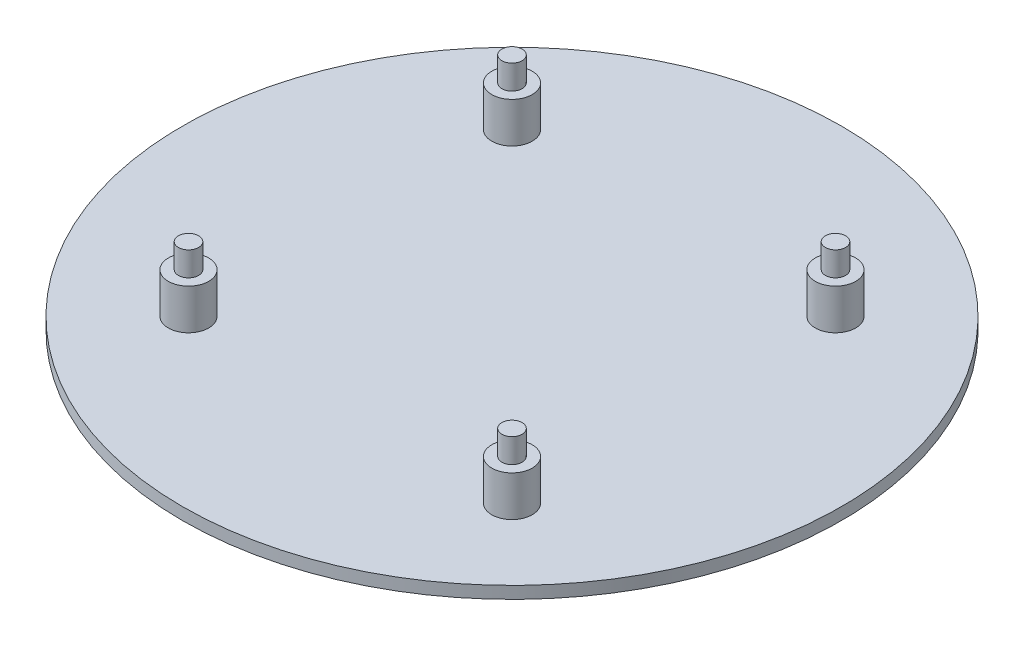
ISO-10303-21;
HEADER;
FILE_DESCRIPTION(('STEP AP214'),'2;1');
FILE_NAME('part.step','',(''),(''),'','','');
FILE_SCHEMA(('AUTOMOTIVE_DESIGN { 1 0 10303 214 1 1 1 1 }'));
ENDSEC;
DATA;
#1=APPLICATION_CONTEXT('core data for automotive mechanical design processes');
#2=APPLICATION_PROTOCOL_DEFINITION('international standard','automotive_design',2000,#1);
#3=PRODUCT_CONTEXT('',#1,'mechanical');
#4=PRODUCT('Part','Part','',(#3));
#5=PRODUCT_RELATED_PRODUCT_CATEGORY('part','',(#4));
#6=PRODUCT_DEFINITION_FORMATION('','',#4);
#7=PRODUCT_DEFINITION_CONTEXT('part definition',#1,'design');
#8=PRODUCT_DEFINITION('design','',#6,#7);
#9=PRODUCT_DEFINITION_SHAPE('','',#8);
#10=(LENGTH_UNIT() NAMED_UNIT(*) SI_UNIT(.MILLI.,.METRE.));
#11=(NAMED_UNIT(*) PLANE_ANGLE_UNIT() SI_UNIT($,.RADIAN.));
#12=(NAMED_UNIT(*) SI_UNIT($,.STERADIAN.) SOLID_ANGLE_UNIT());
#13=UNCERTAINTY_MEASURE_WITH_UNIT(LENGTH_MEASURE(1.E-05),#10,'distance_accuracy_value','');
#14=(GEOMETRIC_REPRESENTATION_CONTEXT(3) GLOBAL_UNCERTAINTY_ASSIGNED_CONTEXT((#13)) GLOBAL_UNIT_ASSIGNED_CONTEXT((#10,
#11,#12)) REPRESENTATION_CONTEXT('',''));
#15=CARTESIAN_POINT('',(0.,0.,0.));
#16=DIRECTION('',(0.,0.,1.));
#17=DIRECTION('',(1.,0.,0.));
#18=AXIS2_PLACEMENT_3D('',#15,#16,#17);
#19=CARTESIAN_POINT('',(0.,3.,0.));
#20=DIRECTION('',(0.,-1.,0.));
#21=DIRECTION('',(0.,0.,-1.));
#22=AXIS2_PLACEMENT_3D('',#19,#20,#21);
#23=CYLINDRICAL_SURFACE('',#22,81.5);
#24=CARTESIAN_POINT('',(0.,3.,0.));
#25=DIRECTION('',(0.,1.,0.));
#26=DIRECTION('',(0.,0.,1.));
#27=AXIS2_PLACEMENT_3D('',#24,#25,#26);
#28=CIRCLE('',#27,81.5);
#29=CARTESIAN_POINT('',(0.,3.,81.5));
#30=VERTEX_POINT('',#29);
#31=EDGE_CURVE('E43',#30,#30,#28,.T.);
#32=ORIENTED_EDGE('',*,*,#31,.F.);
#33=EDGE_LOOP('',(#32));
#34=FACE_BOUND('',#33,.T.);
#35=CARTESIAN_POINT('',(0.,0.,0.));
#36=DIRECTION('',(0.,1.,0.));
#37=DIRECTION('',(0.,0.,1.));
#38=AXIS2_PLACEMENT_3D('',#35,#36,#37);
#39=CIRCLE('',#38,81.5);
#40=CARTESIAN_POINT('',(0.,0.,81.5));
#41=VERTEX_POINT('',#40);
#42=EDGE_CURVE('E47',#41,#41,#39,.T.);
#43=ORIENTED_EDGE('',*,*,#42,.T.);
#44=EDGE_LOOP('',(#43));
#45=FACE_BOUND('',#44,.T.);
#46=ADVANCED_FACE('F33',(#34,#45),#23,.T.);
#47=CARTESIAN_POINT('',(0.,3.,0.));
#48=DIRECTION('',(0.,1.,0.));
#49=DIRECTION('',(0.,0.,1.));
#50=AXIS2_PLACEMENT_3D('',#47,#48,#49);
#51=PLANE('',#50);
#52=CARTESIAN_POINT('',(-39.9999999999999,3.,40.));
#53=DIRECTION('',(0.,1.,0.));
#54=DIRECTION('',(0.,0.,-1.));
#55=AXIS2_PLACEMENT_3D('',#52,#53,#54);
#56=CIRCLE('',#55,5.);
#57=CARTESIAN_POINT('',(-39.9999999999999,3.,35.));
#58=VERTEX_POINT('',#57);
#59=EDGE_CURVE('E71',#58,#58,#56,.T.);
#60=ORIENTED_EDGE('',*,*,#59,.F.);
#61=EDGE_LOOP('',(#60));
#62=FACE_BOUND('',#61,.T.);
#63=CARTESIAN_POINT('',(40.0000000000001,3.,40.));
#64=DIRECTION('',(0.,1.,0.));
#65=DIRECTION('',(0.,0.,1.));
#66=AXIS2_PLACEMENT_3D('',#63,#64,#65);
#67=CIRCLE('',#66,5.);
#68=CARTESIAN_POINT('',(40.0000000000001,3.,45.));
#69=VERTEX_POINT('',#68);
#70=EDGE_CURVE('E65',#69,#69,#67,.T.);
#71=ORIENTED_EDGE('',*,*,#70,.F.);
#72=EDGE_LOOP('',(#71));
#73=FACE_BOUND('',#72,.T.);
#74=CARTESIAN_POINT('',(40.,3.,-40.));
#75=DIRECTION('',(0.,1.,0.));
#76=DIRECTION('',(0.,0.,-1.));
#77=AXIS2_PLACEMENT_3D('',#74,#75,#76);
#78=CIRCLE('',#77,5.);
#79=CARTESIAN_POINT('',(40.,3.,-45.));
#80=VERTEX_POINT('',#79);
#81=EDGE_CURVE('E59',#80,#80,#78,.T.);
#82=ORIENTED_EDGE('',*,*,#81,.F.);
#83=EDGE_LOOP('',(#82));
#84=FACE_BOUND('',#83,.T.);
#85=CARTESIAN_POINT('',(-40.,3.,-40.));
#86=DIRECTION('',(0.,1.,0.));
#87=DIRECTION('',(0.,0.,1.));
#88=AXIS2_PLACEMENT_3D('',#85,#86,#87);
#89=CIRCLE('',#88,5.);
#90=CARTESIAN_POINT('',(-40.,3.,-35.));
#91=VERTEX_POINT('',#90);
#92=EDGE_CURVE('E53',#91,#91,#89,.T.);
#93=ORIENTED_EDGE('',*,*,#92,.F.);
#94=EDGE_LOOP('',(#93));
#95=FACE_BOUND('',#94,.T.);
#96=ORIENTED_EDGE('',*,*,#31,.T.);
#97=EDGE_LOOP('',(#96));
#98=FACE_BOUND('',#97,.T.);
#99=ADVANCED_FACE('F110',(#62,#73,#84,#95,#98),#51,.T.);
#100=CARTESIAN_POINT('',(0.,0.,0.));
#101=DIRECTION('',(0.,1.,0.));
#102=DIRECTION('',(0.,0.,1.));
#103=AXIS2_PLACEMENT_3D('',#100,#101,#102);
#104=PLANE('',#103);
#105=ORIENTED_EDGE('',*,*,#42,.F.);
#106=EDGE_LOOP('',(#105));
#107=FACE_BOUND('',#106,.T.);
#108=ADVANCED_FACE('F115',(#107),#104,.F.);
#109=CARTESIAN_POINT('',(-40.,13.,-40.));
#110=DIRECTION('',(0.,-1.,0.));
#111=DIRECTION('',(0.,0.,-1.));
#112=AXIS2_PLACEMENT_3D('',#109,#110,#111);
#113=CYLINDRICAL_SURFACE('',#112,5.);
#114=CARTESIAN_POINT('',(-40.,13.,-40.));
#115=DIRECTION('',(0.,1.,0.));
#116=DIRECTION('',(0.,0.,1.));
#117=AXIS2_PLACEMENT_3D('',#114,#115,#116);
#118=CIRCLE('',#117,5.);
#119=CARTESIAN_POINT('',(-40.,13.,-35.));
#120=VERTEX_POINT('',#119);
#121=EDGE_CURVE('E51',#120,#120,#118,.T.);
#122=ORIENTED_EDGE('',*,*,#121,.F.);
#123=EDGE_LOOP('',(#122));
#124=FACE_BOUND('',#123,.T.);
#125=ORIENTED_EDGE('',*,*,#92,.T.);
#126=EDGE_LOOP('',(#125));
#127=FACE_BOUND('',#126,.T.);
#128=ADVANCED_FACE('F123',(#124,#127),#113,.T.);
#129=CARTESIAN_POINT('',(-40.,13.,-40.));
#130=DIRECTION('',(0.,1.,0.));
#131=DIRECTION('',(0.,0.,1.));
#132=AXIS2_PLACEMENT_3D('',#129,#130,#131);
#133=PLANE('',#132);
#134=CARTESIAN_POINT('',(-40.,13.,-40.));
#135=DIRECTION('',(0.,1.,0.));
#136=DIRECTION('',(0.,0.,1.));
#137=AXIS2_PLACEMENT_3D('',#134,#135,#136);
#138=CIRCLE('',#137,2.5);
#139=CARTESIAN_POINT('',(-40.,13.,-37.5));
#140=VERTEX_POINT('',#139);
#141=EDGE_CURVE('E77',#140,#140,#138,.T.);
#142=ORIENTED_EDGE('',*,*,#141,.F.);
#143=EDGE_LOOP('',(#142));
#144=FACE_BOUND('',#143,.T.);
#145=ORIENTED_EDGE('',*,*,#121,.T.);
#146=EDGE_LOOP('',(#145));
#147=FACE_BOUND('',#146,.T.);
#148=ADVANCED_FACE('F127',(#144,#147),#133,.T.);
#149=CARTESIAN_POINT('',(40.,13.,-40.));
#150=DIRECTION('',(0.,-1.,0.));
#151=DIRECTION('',(0.,0.,-1.));
#152=AXIS2_PLACEMENT_3D('',#149,#150,#151);
#153=CYLINDRICAL_SURFACE('',#152,5.);
#154=CARTESIAN_POINT('',(40.,13.,-40.));
#155=DIRECTION('',(0.,1.,0.));
#156=DIRECTION('',(0.,0.,-1.));
#157=AXIS2_PLACEMENT_3D('',#154,#155,#156);
#158=CIRCLE('',#157,5.);
#159=CARTESIAN_POINT('',(40.,13.,-45.));
#160=VERTEX_POINT('',#159);
#161=EDGE_CURVE('E56',#160,#160,#158,.T.);
#162=ORIENTED_EDGE('',*,*,#161,.F.);
#163=EDGE_LOOP('',(#162));
#164=FACE_BOUND('',#163,.T.);
#165=ORIENTED_EDGE('',*,*,#81,.T.);
#166=EDGE_LOOP('',(#165));
#167=FACE_BOUND('',#166,.T.);
#168=ADVANCED_FACE('F133',(#164,#167),#153,.T.);
#169=CARTESIAN_POINT('',(40.,13.,-40.));
#170=DIRECTION('',(0.,-1.,0.));
#171=DIRECTION('',(0.,0.,-1.));
#172=AXIS2_PLACEMENT_3D('',#169,#170,#171);
#173=PLANE('',#172);
#174=CARTESIAN_POINT('',(40.,13.,-40.));
#175=DIRECTION('',(0.,-1.,0.));
#176=DIRECTION('',(0.,0.,-1.));
#177=AXIS2_PLACEMENT_3D('',#174,#175,#176);
#178=CIRCLE('',#177,2.5);
#179=CARTESIAN_POINT('',(40.,13.,-42.5));
#180=VERTEX_POINT('',#179);
#181=EDGE_CURVE('E39',#180,#180,#178,.F.);
#182=ORIENTED_EDGE('',*,*,#181,.F.);
#183=EDGE_LOOP('',(#182));
#184=FACE_BOUND('',#183,.T.);
#185=ORIENTED_EDGE('',*,*,#161,.T.);
#186=EDGE_LOOP('',(#185));
#187=FACE_BOUND('',#186,.T.);
#188=ADVANCED_FACE('F137',(#184,#187),#173,.F.);
#189=CARTESIAN_POINT('',(40.0000000000001,13.,40.));
#190=DIRECTION('',(0.,-1.,0.));
#191=DIRECTION('',(0.,0.,-1.));
#192=AXIS2_PLACEMENT_3D('',#189,#190,#191);
#193=CYLINDRICAL_SURFACE('',#192,5.);
#194=CARTESIAN_POINT('',(40.0000000000001,13.,40.));
#195=DIRECTION('',(0.,1.,0.));
#196=DIRECTION('',(0.,0.,1.));
#197=AXIS2_PLACEMENT_3D('',#194,#195,#196);
#198=CIRCLE('',#197,5.);
#199=CARTESIAN_POINT('',(40.0000000000001,13.,45.));
#200=VERTEX_POINT('',#199);
#201=EDGE_CURVE('E62',#200,#200,#198,.T.);
#202=ORIENTED_EDGE('',*,*,#201,.F.);
#203=EDGE_LOOP('',(#202));
#204=FACE_BOUND('',#203,.T.);
#205=ORIENTED_EDGE('',*,*,#70,.T.);
#206=EDGE_LOOP('',(#205));
#207=FACE_BOUND('',#206,.T.);
#208=ADVANCED_FACE('F141',(#204,#207),#193,.T.);
#209=CARTESIAN_POINT('',(40.0000000000001,13.,40.));
#210=DIRECTION('',(0.,1.,0.));
#211=DIRECTION('',(0.,0.,1.));
#212=AXIS2_PLACEMENT_3D('',#209,#210,#211);
#213=PLANE('',#212);
#214=CARTESIAN_POINT('',(40.0000000000001,13.,40.));
#215=DIRECTION('',(0.,1.,0.));
#216=DIRECTION('',(0.,0.,1.));
#217=AXIS2_PLACEMENT_3D('',#214,#215,#216);
#218=CIRCLE('',#217,2.5);
#219=CARTESIAN_POINT('',(40.0000000000001,13.,42.5));
#220=VERTEX_POINT('',#219);
#221=EDGE_CURVE('E86',#220,#220,#218,.T.);
#222=ORIENTED_EDGE('',*,*,#221,.F.);
#223=EDGE_LOOP('',(#222));
#224=FACE_BOUND('',#223,.T.);
#225=ORIENTED_EDGE('',*,*,#201,.T.);
#226=EDGE_LOOP('',(#225));
#227=FACE_BOUND('',#226,.T.);
#228=ADVANCED_FACE('F145',(#224,#227),#213,.T.);
#229=CARTESIAN_POINT('',(-39.9999999999999,13.,40.));
#230=DIRECTION('',(0.,-1.,0.));
#231=DIRECTION('',(0.,0.,-1.));
#232=AXIS2_PLACEMENT_3D('',#229,#230,#231);
#233=CYLINDRICAL_SURFACE('',#232,5.);
#234=CARTESIAN_POINT('',(-39.9999999999999,13.,40.));
#235=DIRECTION('',(0.,1.,0.));
#236=DIRECTION('',(0.,0.,-1.));
#237=AXIS2_PLACEMENT_3D('',#234,#235,#236);
#238=CIRCLE('',#237,5.);
#239=CARTESIAN_POINT('',(-39.9999999999999,13.,35.));
#240=VERTEX_POINT('',#239);
#241=EDGE_CURVE('E68',#240,#240,#238,.T.);
#242=ORIENTED_EDGE('',*,*,#241,.F.);
#243=EDGE_LOOP('',(#242));
#244=FACE_BOUND('',#243,.T.);
#245=ORIENTED_EDGE('',*,*,#59,.T.);
#246=EDGE_LOOP('',(#245));
#247=FACE_BOUND('',#246,.T.);
#248=ADVANCED_FACE('F149',(#244,#247),#233,.T.);
#249=CARTESIAN_POINT('',(-39.9999999999999,13.,40.));
#250=DIRECTION('',(0.,-1.,0.));
#251=DIRECTION('',(0.,0.,-1.));
#252=AXIS2_PLACEMENT_3D('',#249,#250,#251);
#253=PLANE('',#252);
#254=CARTESIAN_POINT('',(-39.9999999999999,13.,40.));
#255=DIRECTION('',(0.,-1.,0.));
#256=DIRECTION('',(0.,0.,-1.));
#257=AXIS2_PLACEMENT_3D('',#254,#255,#256);
#258=CIRCLE('',#257,2.5);
#259=CARTESIAN_POINT('',(-39.9999999999999,13.,37.5));
#260=VERTEX_POINT('',#259);
#261=EDGE_CURVE('E10',#260,#260,#258,.F.);
#262=ORIENTED_EDGE('',*,*,#261,.F.);
#263=EDGE_LOOP('',(#262));
#264=FACE_BOUND('',#263,.T.);
#265=ORIENTED_EDGE('',*,*,#241,.T.);
#266=EDGE_LOOP('',(#265));
#267=FACE_BOUND('',#266,.T.);
#268=ADVANCED_FACE('F153',(#264,#267),#253,.F.);
#269=CARTESIAN_POINT('',(-40.,19.,-40.));
#270=DIRECTION('',(0.,-1.,0.));
#271=DIRECTION('',(0.,0.,-1.));
#272=AXIS2_PLACEMENT_3D('',#269,#270,#271);
#273=CYLINDRICAL_SURFACE('',#272,2.5);
#274=CARTESIAN_POINT('',(-40.,19.,-40.));
#275=DIRECTION('',(0.,1.,0.));
#276=DIRECTION('',(0.,0.,1.));
#277=AXIS2_PLACEMENT_3D('',#274,#275,#276);
#278=CIRCLE('',#277,2.5);
#279=CARTESIAN_POINT('',(-40.,19.,-37.5));
#280=VERTEX_POINT('',#279);
#281=EDGE_CURVE('E74',#280,#280,#278,.T.);
#282=ORIENTED_EDGE('',*,*,#281,.F.);
#283=EDGE_LOOP('',(#282));
#284=FACE_BOUND('',#283,.T.);
#285=ORIENTED_EDGE('',*,*,#141,.T.);
#286=EDGE_LOOP('',(#285));
#287=FACE_BOUND('',#286,.T.);
#288=ADVANCED_FACE('F157',(#284,#287),#273,.T.);
#289=CARTESIAN_POINT('',(-40.,19.,-40.));
#290=DIRECTION('',(0.,1.,0.));
#291=DIRECTION('',(0.,0.,1.));
#292=AXIS2_PLACEMENT_3D('',#289,#290,#291);
#293=PLANE('',#292);
#294=ORIENTED_EDGE('',*,*,#281,.T.);
#295=EDGE_LOOP('',(#294));
#296=FACE_BOUND('',#295,.T.);
#297=ADVANCED_FACE('F161',(#296),#293,.T.);
#298=CARTESIAN_POINT('',(40.,19.,-40.));
#299=DIRECTION('',(0.,-1.,0.));
#300=DIRECTION('',(0.,0.,-1.));
#301=AXIS2_PLACEMENT_3D('',#298,#299,#300);
#302=CYLINDRICAL_SURFACE('',#301,2.5);
#303=CARTESIAN_POINT('',(40.,19.,-40.));
#304=DIRECTION('',(0.,1.,0.));
#305=DIRECTION('',(0.,0.,1.));
#306=AXIS2_PLACEMENT_3D('',#303,#304,#305);
#307=CIRCLE('',#306,2.5);
#308=CARTESIAN_POINT('',(40.,19.,-37.5));
#309=VERTEX_POINT('',#308);
#310=EDGE_CURVE('E80',#309,#309,#307,.T.);
#311=ORIENTED_EDGE('',*,*,#310,.F.);
#312=EDGE_LOOP('',(#311));
#313=FACE_BOUND('',#312,.T.);
#314=ORIENTED_EDGE('',*,*,#181,.T.);
#315=EDGE_LOOP('',(#314));
#316=FACE_BOUND('',#315,.T.);
#317=ADVANCED_FACE('F165',(#313,#316),#302,.T.);
#318=CARTESIAN_POINT('',(40.,19.,-40.));
#319=DIRECTION('',(0.,1.,0.));
#320=DIRECTION('',(0.,0.,1.));
#321=AXIS2_PLACEMENT_3D('',#318,#319,#320);
#322=PLANE('',#321);
#323=ORIENTED_EDGE('',*,*,#310,.T.);
#324=EDGE_LOOP('',(#323));
#325=FACE_BOUND('',#324,.T.);
#326=ADVANCED_FACE('F169',(#325),#322,.T.);
#327=CARTESIAN_POINT('',(40.0000000000001,19.,40.));
#328=DIRECTION('',(0.,-1.,0.));
#329=DIRECTION('',(0.,0.,-1.));
#330=AXIS2_PLACEMENT_3D('',#327,#328,#329);
#331=CYLINDRICAL_SURFACE('',#330,2.5);
#332=CARTESIAN_POINT('',(40.0000000000001,19.,40.));
#333=DIRECTION('',(0.,1.,0.));
#334=DIRECTION('',(0.,0.,1.));
#335=AXIS2_PLACEMENT_3D('',#332,#333,#334);
#336=CIRCLE('',#335,2.5);
#337=CARTESIAN_POINT('',(40.0000000000001,19.,42.5));
#338=VERTEX_POINT('',#337);
#339=EDGE_CURVE('E85',#338,#338,#336,.T.);
#340=ORIENTED_EDGE('',*,*,#339,.F.);
#341=EDGE_LOOP('',(#340));
#342=FACE_BOUND('',#341,.T.);
#343=ORIENTED_EDGE('',*,*,#221,.T.);
#344=EDGE_LOOP('',(#343));
#345=FACE_BOUND('',#344,.T.);
#346=ADVANCED_FACE('F106',(#342,#345),#331,.T.);
#347=CARTESIAN_POINT('',(40.0000000000001,19.,40.));
#348=DIRECTION('',(0.,1.,0.));
#349=DIRECTION('',(0.,0.,1.));
#350=AXIS2_PLACEMENT_3D('',#347,#348,#349);
#351=PLANE('',#350);
#352=ORIENTED_EDGE('',*,*,#339,.T.);
#353=EDGE_LOOP('',(#352));
#354=FACE_BOUND('',#353,.T.);
#355=ADVANCED_FACE('F99',(#354),#351,.T.);
#356=CARTESIAN_POINT('',(-39.9999999999999,19.,40.));
#357=DIRECTION('',(0.,-1.,0.));
#358=DIRECTION('',(0.,0.,-1.));
#359=AXIS2_PLACEMENT_3D('',#356,#357,#358);
#360=CYLINDRICAL_SURFACE('',#359,2.5);
#361=CARTESIAN_POINT('',(-39.9999999999999,19.,40.));
#362=DIRECTION('',(0.,1.,0.));
#363=DIRECTION('',(0.,0.,1.));
#364=AXIS2_PLACEMENT_3D('',#361,#362,#363);
#365=CIRCLE('',#364,2.5);
#366=CARTESIAN_POINT('',(-39.9999999999999,19.,42.5));
#367=VERTEX_POINT('',#366);
#368=EDGE_CURVE('E89',#367,#367,#365,.T.);
#369=ORIENTED_EDGE('',*,*,#368,.F.);
#370=EDGE_LOOP('',(#369));
#371=FACE_BOUND('',#370,.T.);
#372=ORIENTED_EDGE('',*,*,#261,.T.);
#373=EDGE_LOOP('',(#372));
#374=FACE_BOUND('',#373,.T.);
#375=ADVANCED_FACE('F97',(#371,#374),#360,.T.);
#376=CARTESIAN_POINT('',(-39.9999999999999,19.,40.));
#377=DIRECTION('',(0.,1.,0.));
#378=DIRECTION('',(0.,0.,1.));
#379=AXIS2_PLACEMENT_3D('',#376,#377,#378);
#380=PLANE('',#379);
#381=ORIENTED_EDGE('',*,*,#368,.T.);
#382=EDGE_LOOP('',(#381));
#383=FACE_BOUND('',#382,.T.);
#384=ADVANCED_FACE('F95',(#383),#380,.T.);
#385=CLOSED_SHELL('',(#46,#99,#108,#128,#148,#168,#188,#208,#228,#248,#268,#288,#297,#317,#326,
#346,#355,#375,#384));
#386=MANIFOLD_SOLID_BREP('B2',#385);
#387=ADVANCED_BREP_SHAPE_REPRESENTATION('',(#18,#386),#14);
#388=SHAPE_DEFINITION_REPRESENTATION(#9,#387);
ENDSEC;
END-ISO-10303-21;
